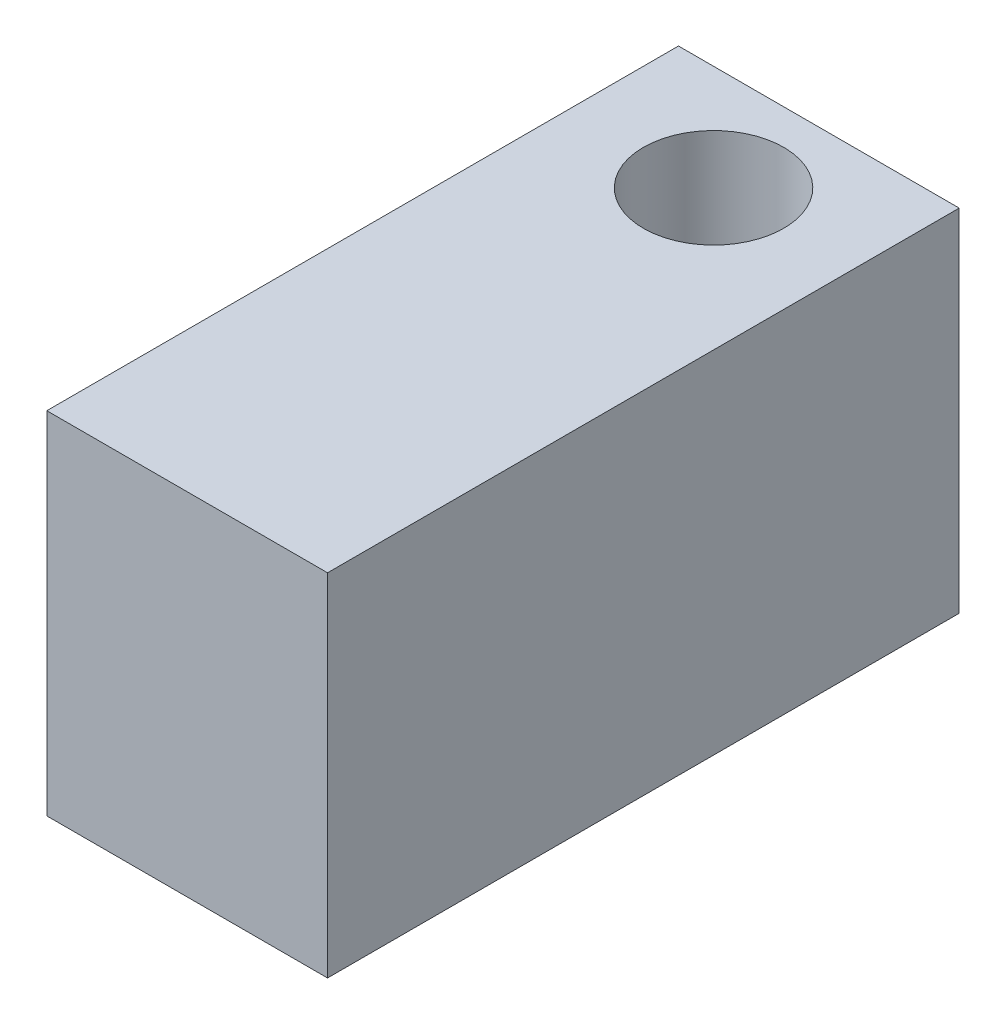
ISO-10303-21;
HEADER;
FILE_DESCRIPTION(('STEP AP214'),'2;1');
FILE_NAME('part.step','',(''),(''),'','','');
FILE_SCHEMA(('AUTOMOTIVE_DESIGN { 1 0 10303 214 1 1 1 1 }'));
ENDSEC;
DATA;
#1=APPLICATION_CONTEXT('core data for automotive mechanical design processes');
#2=APPLICATION_PROTOCOL_DEFINITION('international standard','automotive_design',2000,#1);
#3=PRODUCT_CONTEXT('',#1,'mechanical');
#4=PRODUCT('Part','Part','',(#3));
#5=PRODUCT_RELATED_PRODUCT_CATEGORY('part','',(#4));
#6=PRODUCT_DEFINITION_FORMATION('','',#4);
#7=PRODUCT_DEFINITION_CONTEXT('part definition',#1,'design');
#8=PRODUCT_DEFINITION('design','',#6,#7);
#9=PRODUCT_DEFINITION_SHAPE('','',#8);
#10=(LENGTH_UNIT() NAMED_UNIT(*) SI_UNIT(.MILLI.,.METRE.));
#11=(NAMED_UNIT(*) PLANE_ANGLE_UNIT() SI_UNIT($,.RADIAN.));
#12=(NAMED_UNIT(*) SI_UNIT($,.STERADIAN.) SOLID_ANGLE_UNIT());
#13=UNCERTAINTY_MEASURE_WITH_UNIT(LENGTH_MEASURE(1.E-05),#10,'distance_accuracy_value','');
#14=(GEOMETRIC_REPRESENTATION_CONTEXT(3) GLOBAL_UNCERTAINTY_ASSIGNED_CONTEXT((#13)) GLOBAL_UNIT_ASSIGNED_CONTEXT((#10,
#11,#12)) REPRESENTATION_CONTEXT('',''));
#15=CARTESIAN_POINT('',(0.,0.,0.));
#16=DIRECTION('',(0.,0.,1.));
#17=DIRECTION('',(1.,0.,0.));
#18=AXIS2_PLACEMENT_3D('',#15,#16,#17);
#19=CARTESIAN_POINT('',(-20.,-25.,90.));
#20=DIRECTION('',(1.,0.,0.));
#21=DIRECTION('',(0.,0.,-1.));
#22=AXIS2_PLACEMENT_3D('',#19,#20,#21);
#23=PLANE('',#22);
#24=DIRECTION('',(0.,-1.,0.));
#25=VECTOR('',#24,1.);
#26=CARTESIAN_POINT('',(-20.,-25.,0.));
#27=LINE('',#26,#25);
#28=CARTESIAN_POINT('',(-20.,25.,0.));
#29=VERTEX_POINT('',#28);
#30=CARTESIAN_POINT('',(-20.,-25.,0.));
#31=VERTEX_POINT('',#30);
#32=EDGE_CURVE('E107',#29,#31,#27,.T.);
#33=ORIENTED_EDGE('',*,*,#32,.T.);
#34=DIRECTION('',(0.,0.,-1.));
#35=VECTOR('',#34,1.);
#36=CARTESIAN_POINT('',(-20.,-25.,90.));
#37=LINE('',#36,#35);
#38=CARTESIAN_POINT('',(-20.,-25.,90.));
#39=VERTEX_POINT('',#38);
#40=EDGE_CURVE('E11',#39,#31,#37,.T.);
#41=ORIENTED_EDGE('',*,*,#40,.F.);
#42=DIRECTION('',(0.,-1.,0.));
#43=VECTOR('',#42,1.);
#44=CARTESIAN_POINT('',(-20.,-25.,90.));
#45=LINE('',#44,#43);
#46=CARTESIAN_POINT('',(-20.,25.,90.));
#47=VERTEX_POINT('',#46);
#48=EDGE_CURVE('E91',#47,#39,#45,.T.);
#49=ORIENTED_EDGE('',*,*,#48,.F.);
#50=DIRECTION('',(0.,0.,-1.));
#51=VECTOR('',#50,1.);
#52=CARTESIAN_POINT('',(-20.,25.,90.));
#53=LINE('',#52,#51);
#54=EDGE_CURVE('E103',#47,#29,#53,.T.);
#55=ORIENTED_EDGE('',*,*,#54,.T.);
#56=EDGE_LOOP('',(#33,#41,#49,#55));
#57=FACE_BOUND('',#56,.T.);
#58=ADVANCED_FACE('F39',(#57),#23,.F.);
#59=CARTESIAN_POINT('',(20.,-25.,90.));
#60=DIRECTION('',(0.,1.,0.));
#61=DIRECTION('',(-1.,0.,0.));
#62=AXIS2_PLACEMENT_3D('',#59,#60,#61);
#63=PLANE('',#62);
#64=CARTESIAN_POINT('',(0.,-25.,15.));
#65=DIRECTION('',(0.,1.,0.));
#66=DIRECTION('',(-1.,0.,0.));
#67=AXIS2_PLACEMENT_3D('',#64,#65,#66);
#68=CIRCLE('',#67,10.);
#69=CARTESIAN_POINT('',(-10.,-25.,15.));
#70=VERTEX_POINT('',#69);
#71=EDGE_CURVE('E111',#70,#70,#68,.F.);
#72=ORIENTED_EDGE('',*,*,#71,.F.);
#73=EDGE_LOOP('',(#72));
#74=FACE_BOUND('',#73,.T.);
#75=DIRECTION('',(1.,0.,0.));
#76=VECTOR('',#75,1.);
#77=CARTESIAN_POINT('',(20.,-25.,0.));
#78=LINE('',#77,#76);
#79=CARTESIAN_POINT('',(20.,-25.,0.));
#80=VERTEX_POINT('',#79);
#81=EDGE_CURVE('E96',#31,#80,#78,.T.);
#82=ORIENTED_EDGE('',*,*,#81,.T.);
#83=DIRECTION('',(0.,0.,-1.));
#84=VECTOR('',#83,1.);
#85=CARTESIAN_POINT('',(20.,-25.,90.));
#86=LINE('',#85,#84);
#87=CARTESIAN_POINT('',(20.,-25.,90.));
#88=VERTEX_POINT('',#87);
#89=EDGE_CURVE('E48',#88,#80,#86,.T.);
#90=ORIENTED_EDGE('',*,*,#89,.F.);
#91=DIRECTION('',(1.,0.,0.));
#92=VECTOR('',#91,1.);
#93=CARTESIAN_POINT('',(20.,-25.,90.));
#94=LINE('',#93,#92);
#95=EDGE_CURVE('E86',#39,#88,#94,.T.);
#96=ORIENTED_EDGE('',*,*,#95,.F.);
#97=ORIENTED_EDGE('',*,*,#40,.T.);
#98=EDGE_LOOP('',(#82,#90,#96,#97));
#99=FACE_BOUND('',#98,.T.);
#100=ADVANCED_FACE('F95',(#74,#99),#63,.F.);
#101=CARTESIAN_POINT('',(20.,-25.,90.));
#102=DIRECTION('',(-1.,0.,0.));
#103=DIRECTION('',(0.,0.,1.));
#104=AXIS2_PLACEMENT_3D('',#101,#102,#103);
#105=PLANE('',#104);
#106=DIRECTION('',(0.,1.,0.));
#107=VECTOR('',#106,1.);
#108=CARTESIAN_POINT('',(20.,-25.,0.));
#109=LINE('',#108,#107);
#110=CARTESIAN_POINT('',(20.,25.,0.));
#111=VERTEX_POINT('',#110);
#112=EDGE_CURVE('E73',#80,#111,#109,.T.);
#113=ORIENTED_EDGE('',*,*,#112,.T.);
#114=DIRECTION('',(0.,0.,-1.));
#115=VECTOR('',#114,1.);
#116=CARTESIAN_POINT('',(20.,25.,90.));
#117=LINE('',#116,#115);
#118=CARTESIAN_POINT('',(20.,25.,90.));
#119=VERTEX_POINT('',#118);
#120=EDGE_CURVE('E98',#119,#111,#117,.T.);
#121=ORIENTED_EDGE('',*,*,#120,.F.);
#122=DIRECTION('',(0.,1.,0.));
#123=VECTOR('',#122,1.);
#124=CARTESIAN_POINT('',(20.,-25.,90.));
#125=LINE('',#124,#123);
#126=EDGE_CURVE('E89',#88,#119,#125,.T.);
#127=ORIENTED_EDGE('',*,*,#126,.F.);
#128=ORIENTED_EDGE('',*,*,#89,.T.);
#129=EDGE_LOOP('',(#113,#121,#127,#128));
#130=FACE_BOUND('',#129,.T.);
#131=ADVANCED_FACE('F99',(#130),#105,.F.);
#132=CARTESIAN_POINT('',(20.,25.,90.));
#133=DIRECTION('',(0.,-1.,0.));
#134=DIRECTION('',(1.,0.,0.));
#135=AXIS2_PLACEMENT_3D('',#132,#133,#134);
#136=PLANE('',#135);
#137=CARTESIAN_POINT('',(0.,25.,15.));
#138=DIRECTION('',(0.,1.,0.));
#139=DIRECTION('',(-1.,0.,0.));
#140=AXIS2_PLACEMENT_3D('',#137,#138,#139);
#141=CIRCLE('',#140,10.);
#142=CARTESIAN_POINT('',(-10.,25.,15.));
#143=VERTEX_POINT('',#142);
#144=EDGE_CURVE('E131',#143,#143,#141,.T.);
#145=ORIENTED_EDGE('',*,*,#144,.F.);
#146=EDGE_LOOP('',(#145));
#147=FACE_BOUND('',#146,.T.);
#148=DIRECTION('',(-1.,0.,0.));
#149=VECTOR('',#148,1.);
#150=CARTESIAN_POINT('',(20.,25.,0.));
#151=LINE('',#150,#149);
#152=EDGE_CURVE('E79',#111,#29,#151,.T.);
#153=ORIENTED_EDGE('',*,*,#152,.T.);
#154=ORIENTED_EDGE('',*,*,#54,.F.);
#155=DIRECTION('',(-1.,0.,0.));
#156=VECTOR('',#155,1.);
#157=CARTESIAN_POINT('',(20.,25.,90.));
#158=LINE('',#157,#156);
#159=EDGE_CURVE('E56',#119,#47,#158,.T.);
#160=ORIENTED_EDGE('',*,*,#159,.F.);
#161=ORIENTED_EDGE('',*,*,#120,.T.);
#162=EDGE_LOOP('',(#153,#154,#160,#161));
#163=FACE_BOUND('',#162,.T.);
#164=ADVANCED_FACE('F121',(#147,#163),#136,.F.);
#165=CARTESIAN_POINT('',(0.,0.,90.));
#166=DIRECTION('',(0.,0.,1.));
#167=DIRECTION('',(1.,0.,0.));
#168=AXIS2_PLACEMENT_3D('',#165,#166,#167);
#169=PLANE('',#168);
#170=ORIENTED_EDGE('',*,*,#48,.T.);
#171=ORIENTED_EDGE('',*,*,#95,.T.);
#172=ORIENTED_EDGE('',*,*,#126,.T.);
#173=ORIENTED_EDGE('',*,*,#159,.T.);
#174=EDGE_LOOP('',(#170,#171,#172,#173));
#175=FACE_BOUND('',#174,.T.);
#176=ADVANCED_FACE('F87',(#175),#169,.T.);
#177=CARTESIAN_POINT('',(0.,0.,0.));
#178=DIRECTION('',(0.,0.,1.));
#179=DIRECTION('',(1.,0.,0.));
#180=AXIS2_PLACEMENT_3D('',#177,#178,#179);
#181=PLANE('',#180);
#182=ORIENTED_EDGE('',*,*,#32,.F.);
#183=ORIENTED_EDGE('',*,*,#152,.F.);
#184=ORIENTED_EDGE('',*,*,#112,.F.);
#185=ORIENTED_EDGE('',*,*,#81,.F.);
#186=EDGE_LOOP('',(#182,#183,#184,#185));
#187=FACE_BOUND('',#186,.T.);
#188=ADVANCED_FACE('F124',(#187),#181,.F.);
#189=CARTESIAN_POINT('',(0.,-25.001,15.));
#190=DIRECTION('',(0.,1.,0.));
#191=DIRECTION('',(-1.,0.,0.));
#192=AXIS2_PLACEMENT_3D('',#189,#190,#191);
#193=CYLINDRICAL_SURFACE('',#192,10.);
#194=ORIENTED_EDGE('',*,*,#144,.T.);
#195=EDGE_LOOP('',(#194));
#196=FACE_BOUND('',#195,.T.);
#197=ORIENTED_EDGE('',*,*,#71,.T.);
#198=EDGE_LOOP('',(#197));
#199=FACE_BOUND('',#198,.T.);
#200=ADVANCED_FACE('F136',(#196,#199),#193,.F.);
#201=CLOSED_SHELL('',(#58,#100,#131,#164,#176,#188,#200));
#202=MANIFOLD_SOLID_BREP('B2',#201);
#203=ADVANCED_BREP_SHAPE_REPRESENTATION('',(#18,#202),#14);
#204=SHAPE_DEFINITION_REPRESENTATION(#9,#203);
ENDSEC;
END-ISO-10303-21;
